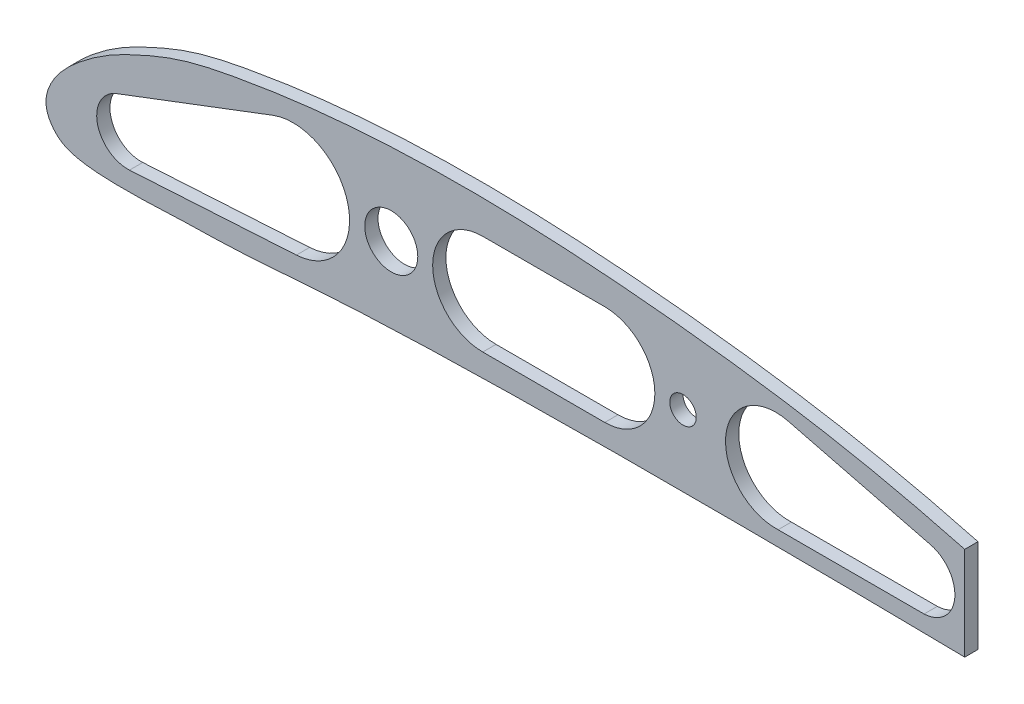
ISO-10303-21;
HEADER;
FILE_DESCRIPTION(('STEP AP214'),'2;1');
FILE_NAME('part.step','',(''),(''),'','','');
FILE_SCHEMA(('AUTOMOTIVE_DESIGN { 1 0 10303 214 1 1 1 1 }'));
ENDSEC;
DATA;
#1=APPLICATION_CONTEXT('core data for automotive mechanical design processes');
#2=APPLICATION_PROTOCOL_DEFINITION('international standard','automotive_design',2000,#1);
#3=PRODUCT_CONTEXT('',#1,'mechanical');
#4=PRODUCT('Part','Part','',(#3));
#5=PRODUCT_RELATED_PRODUCT_CATEGORY('part','',(#4));
#6=PRODUCT_DEFINITION_FORMATION('','',#4);
#7=PRODUCT_DEFINITION_CONTEXT('part definition',#1,'design');
#8=PRODUCT_DEFINITION('design','',#6,#7);
#9=PRODUCT_DEFINITION_SHAPE('','',#8);
#10=(LENGTH_UNIT() NAMED_UNIT(*) SI_UNIT(.MILLI.,.METRE.));
#11=(NAMED_UNIT(*) PLANE_ANGLE_UNIT() SI_UNIT($,.RADIAN.));
#12=(NAMED_UNIT(*) SI_UNIT($,.STERADIAN.) SOLID_ANGLE_UNIT());
#13=UNCERTAINTY_MEASURE_WITH_UNIT(LENGTH_MEASURE(1.E-05),#10,'distance_accuracy_value','');
#14=(GEOMETRIC_REPRESENTATION_CONTEXT(3) GLOBAL_UNCERTAINTY_ASSIGNED_CONTEXT((#13)) GLOBAL_UNIT_ASSIGNED_CONTEXT((#10,
#11,#12)) REPRESENTATION_CONTEXT('',''));
#15=CARTESIAN_POINT('',(0.,0.,0.));
#16=DIRECTION('',(0.,0.,1.));
#17=DIRECTION('',(1.,0.,0.));
#18=AXIS2_PLACEMENT_3D('',#15,#16,#17);
#19=CARTESIAN_POINT('',(59.0328635687362,20.7208074052714,-40.1331610936061));
#20=DIRECTION('',(0.,0.,1.));
#21=DIRECTION('',(1.,0.,0.));
#22=AXIS2_PLACEMENT_3D('',#19,#20,#21);
#23=CYLINDRICAL_SURFACE('',#22,13.5394303652612);
#24=CARTESIAN_POINT('',(59.0328635687362,20.7208074052714,-1.5875));
#25=DIRECTION('',(0.,0.,-1.));
#26=DIRECTION('',(-1.,0.,0.));
#27=AXIS2_PLACEMENT_3D('',#24,#25,#26);
#28=CIRCLE('',#27,13.5394303652612);
#29=CARTESIAN_POINT('',(54.225767065708,33.3781372116063,-1.5875));
#30=VERTEX_POINT('',#29);
#31=CARTESIAN_POINT('',(59.832894926961,7.20503423309904,-1.5875));
#32=VERTEX_POINT('',#31);
#33=EDGE_CURVE('E344',#30,#32,#28,.T.);
#34=ORIENTED_EDGE('',*,*,#33,.T.);
#35=DIRECTION('',(0.,0.,1.));
#36=VECTOR('',#35,1.);
#37=CARTESIAN_POINT('',(59.832894926961,7.20503423309905,-40.1331610936061));
#38=LINE('',#37,#36);
#39=CARTESIAN_POINT('',(59.832894926961,7.20503423309905,1.5875));
#40=VERTEX_POINT('',#39);
#41=EDGE_CURVE('E232',#32,#40,#38,.T.);
#42=ORIENTED_EDGE('',*,*,#41,.T.);
#43=CARTESIAN_POINT('',(59.0328635687362,20.7208074052714,1.5875));
#44=DIRECTION('',(0.,0.,1.));
#45=DIRECTION('',(1.,0.,0.));
#46=AXIS2_PLACEMENT_3D('',#43,#44,#45);
#47=CIRCLE('',#46,13.5394303652612);
#48=CARTESIAN_POINT('',(54.225767065708,33.3781372116063,1.5875));
#49=VERTEX_POINT('',#48);
#50=EDGE_CURVE('E228',#40,#49,#47,.T.);
#51=ORIENTED_EDGE('',*,*,#50,.T.);
#52=DIRECTION('',(0.,0.,1.));
#53=VECTOR('',#52,1.);
#54=CARTESIAN_POINT('',(54.225767065708,33.3781372116063,-40.1331610936061));
#55=LINE('',#54,#53);
#56=EDGE_CURVE('E231',#30,#49,#55,.T.);
#57=ORIENTED_EDGE('',*,*,#56,.F.);
#58=EDGE_LOOP('',(#34,#42,#51,#57));
#59=FACE_BOUND('',#58,.T.);
#60=ADVANCED_FACE('F102',(#59),#23,.F.);
#61=CARTESIAN_POINT('',(16.8041816122865,19.1658842859631,-40.1331610936061));
#62=DIRECTION('',(0.355044220720096,-0.934849507318295,0.));
#63=DIRECTION('',(0.934849507318296,0.355044220720096,0.));
#64=AXIS2_PLACEMENT_3D('',#61,#62,#63);
#65=PLANE('',#64);
#66=ORIENTED_EDGE('',*,*,#56,.T.);
#67=DIRECTION('',(0.934849507318295,0.355044220720096,0.));
#68=VECTOR('',#67,1.);
#69=CARTESIAN_POINT('',(16.8041816122865,19.1658842859631,1.5875));
#70=LINE('',#69,#68);
#71=CARTESIAN_POINT('',(16.8041816122865,19.1658842859631,1.5875));
#72=VERTEX_POINT('',#71);
#73=EDGE_CURVE('E212',#72,#49,#70,.T.);
#74=ORIENTED_EDGE('',*,*,#73,.F.);
#75=DIRECTION('',(0.,0.,1.));
#76=VECTOR('',#75,1.);
#77=CARTESIAN_POINT('',(16.8041816122865,19.1658842859631,-40.1331610936061));
#78=LINE('',#77,#76);
#79=CARTESIAN_POINT('',(16.8041816122865,19.1658842859631,-1.5875));
#80=VERTEX_POINT('',#79);
#81=EDGE_CURVE('E226',#80,#72,#78,.T.);
#82=ORIENTED_EDGE('',*,*,#81,.F.);
#83=DIRECTION('',(-0.934849507318296,-0.355044220720096,0.));
#84=VECTOR('',#83,1.);
#85=CARTESIAN_POINT('',(2.00495325549026,13.5453213418052,-1.5875));
#86=LINE('',#85,#84);
#87=EDGE_CURVE('E241',#30,#80,#86,.T.);
#88=ORIENTED_EDGE('',*,*,#87,.F.);
#89=EDGE_LOOP('',(#66,#74,#82,#88));
#90=FACE_BOUND('',#89,.T.);
#91=ADVANCED_FACE('F267',(#90),#65,.T.);
#92=CARTESIAN_POINT('',(19.4354022409776,12.2377464236183,-40.1331610936061));
#93=DIRECTION('',(0.,0.,1.));
#94=DIRECTION('',(1.,0.,0.));
#95=AXIS2_PLACEMENT_3D('',#92,#93,#94);
#96=CYLINDRICAL_SURFACE('',#95,7.41096594490252);
#97=CARTESIAN_POINT('',(19.4354022409776,12.2377464236183,-1.5875));
#98=DIRECTION('',(0.,0.,-1.));
#99=DIRECTION('',(-1.,0.,0.));
#100=AXIS2_PLACEMENT_3D('',#97,#98,#99);
#101=CIRCLE('',#100,7.41096594490252);
#102=CARTESIAN_POINT('',(19.873308784363,4.83972952070676,-1.5875));
#103=VERTEX_POINT('',#102);
#104=EDGE_CURVE('E339',#103,#80,#101,.T.);
#105=ORIENTED_EDGE('',*,*,#104,.T.);
#106=ORIENTED_EDGE('',*,*,#81,.T.);
#107=CARTESIAN_POINT('',(19.4354022409776,12.2377464236183,1.5875));
#108=DIRECTION('',(0.,0.,1.));
#109=DIRECTION('',(1.,0.,0.));
#110=AXIS2_PLACEMENT_3D('',#107,#108,#109);
#111=CIRCLE('',#110,7.41096594490252);
#112=CARTESIAN_POINT('',(19.873308784363,4.83972952070676,1.5875));
#113=VERTEX_POINT('',#112);
#114=EDGE_CURVE('E238',#72,#113,#111,.T.);
#115=ORIENTED_EDGE('',*,*,#114,.T.);
#116=DIRECTION('',(0.,0.,1.));
#117=VECTOR('',#116,1.);
#118=CARTESIAN_POINT('',(19.873308784363,4.83972952070676,-40.1331610936061));
#119=LINE('',#118,#117);
#120=EDGE_CURVE('E237',#103,#113,#119,.T.);
#121=ORIENTED_EDGE('',*,*,#120,.F.);
#122=EDGE_LOOP('',(#105,#106,#115,#121));
#123=FACE_BOUND('',#122,.T.);
#124=ADVANCED_FACE('F273',(#123),#96,.F.);
#125=CARTESIAN_POINT('',(19.873308784363,4.83972952070676,-40.1331610936061));
#126=DIRECTION('',(0.0590889968515589,-0.998252718729619,0.));
#127=DIRECTION('',(0.998252718729619,0.0590889968515589,0.));
#128=AXIS2_PLACEMENT_3D('',#125,#126,#127);
#129=PLANE('',#128);
#130=DIRECTION('',(-0.998252718729619,-0.0590889968515589,0.));
#131=VECTOR('',#130,1.);
#132=CARTESIAN_POINT('',(2.28735495131891,3.79877430848875,-1.5875));
#133=LINE('',#132,#131);
#134=EDGE_CURVE('E240',#32,#103,#133,.T.);
#135=ORIENTED_EDGE('',*,*,#134,.T.);
#136=ORIENTED_EDGE('',*,*,#120,.T.);
#137=DIRECTION('',(0.998252718729619,0.0590889968515589,0.));
#138=VECTOR('',#137,1.);
#139=CARTESIAN_POINT('',(19.873308784363,4.83972952070676,1.5875));
#140=LINE('',#139,#138);
#141=EDGE_CURVE('E233',#113,#40,#140,.T.);
#142=ORIENTED_EDGE('',*,*,#141,.T.);
#143=ORIENTED_EDGE('',*,*,#41,.F.);
#144=EDGE_LOOP('',(#135,#136,#142,#143));
#145=FACE_BOUND('',#144,.T.);
#146=ADVANCED_FACE('F277',(#145),#129,.F.);
#147=CARTESIAN_POINT('',(133.667500000003,21.4122000122882,-40.1331610936061));
#148=DIRECTION('',(0.,0.,1.));
#149=DIRECTION('',(1.,0.,0.));
#150=AXIS2_PLACEMENT_3D('',#147,#148,#149);
#151=CYLINDRICAL_SURFACE('',#150,11.9939854368826);
#152=CARTESIAN_POINT('',(133.667500000003,21.4122000122882,-1.5875));
#153=DIRECTION('',(0.,0.,-1.));
#154=DIRECTION('',(-1.,0.,0.));
#155=AXIS2_PLACEMENT_3D('',#152,#153,#154);
#156=CIRCLE('',#155,11.9939854368826);
#157=CARTESIAN_POINT('',(133.667500000003,33.4061854491708,-1.5875));
#158=VERTEX_POINT('',#157);
#159=CARTESIAN_POINT('',(133.667500000003,9.41821457540555,-1.5875));
#160=VERTEX_POINT('',#159);
#161=EDGE_CURVE('E236',#158,#160,#156,.T.);
#162=ORIENTED_EDGE('',*,*,#161,.T.);
#163=DIRECTION('',(0.,0.,1.));
#164=VECTOR('',#163,1.);
#165=CARTESIAN_POINT('',(133.667500000003,9.41821457540555,-40.1331610936061));
#166=LINE('',#165,#164);
#167=CARTESIAN_POINT('',(133.667500000003,9.41821457540555,1.5875));
#168=VERTEX_POINT('',#167);
#169=EDGE_CURVE('E356',#160,#168,#166,.T.);
#170=ORIENTED_EDGE('',*,*,#169,.T.);
#171=CARTESIAN_POINT('',(133.667500000003,21.4122000122882,1.5875));
#172=DIRECTION('',(0.,0.,1.));
#173=DIRECTION('',(1.,0.,0.));
#174=AXIS2_PLACEMENT_3D('',#171,#172,#173);
#175=CIRCLE('',#174,11.9939854368826);
#176=CARTESIAN_POINT('',(133.667500000003,33.4061854491708,1.5875));
#177=VERTEX_POINT('',#176);
#178=EDGE_CURVE('E389',#168,#177,#175,.T.);
#179=ORIENTED_EDGE('',*,*,#178,.T.);
#180=DIRECTION('',(0.,0.,1.));
#181=VECTOR('',#180,1.);
#182=CARTESIAN_POINT('',(133.667500000003,33.4061854491708,-40.1331610936061));
#183=LINE('',#182,#181);
#184=EDGE_CURVE('E350',#158,#177,#183,.T.);
#185=ORIENTED_EDGE('',*,*,#184,.F.);
#186=EDGE_LOOP('',(#162,#170,#179,#185));
#187=FACE_BOUND('',#186,.T.);
#188=ADVANCED_FACE('F280',(#187),#151,.F.);
#189=CARTESIAN_POINT('',(104.457500000003,33.4061854491708,-40.1331610936061));
#190=DIRECTION('',(0.,-1.,0.));
#191=DIRECTION('',(1.,0.,0.));
#192=AXIS2_PLACEMENT_3D('',#189,#190,#191);
#193=PLANE('',#192);
#194=ORIENTED_EDGE('',*,*,#184,.T.);
#195=DIRECTION('',(1.,0.,0.));
#196=VECTOR('',#195,1.);
#197=CARTESIAN_POINT('',(104.457500000003,33.4061854491708,1.5875));
#198=LINE('',#197,#196);
#199=CARTESIAN_POINT('',(104.457500000003,33.4061854491708,1.5875));
#200=VERTEX_POINT('',#199);
#201=EDGE_CURVE('E215',#200,#177,#198,.T.);
#202=ORIENTED_EDGE('',*,*,#201,.F.);
#203=DIRECTION('',(0.,0.,1.));
#204=VECTOR('',#203,1.);
#205=CARTESIAN_POINT('',(104.457500000003,33.4061854491708,-40.1331610936061));
#206=LINE('',#205,#204);
#207=CARTESIAN_POINT('',(104.457500000003,33.4061854491708,-1.5875));
#208=VERTEX_POINT('',#207);
#209=EDGE_CURVE('E349',#208,#200,#206,.T.);
#210=ORIENTED_EDGE('',*,*,#209,.F.);
#211=DIRECTION('',(-1.,0.,0.));
#212=VECTOR('',#211,1.);
#213=CARTESIAN_POINT('',(1.65605512116518,33.4061854491707,-1.5875));
#214=LINE('',#213,#212);
#215=EDGE_CURVE('E343',#158,#208,#214,.T.);
#216=ORIENTED_EDGE('',*,*,#215,.F.);
#217=EDGE_LOOP('',(#194,#202,#210,#216));
#218=FACE_BOUND('',#217,.T.);
#219=ADVANCED_FACE('F289',(#218),#193,.T.);
#220=CARTESIAN_POINT('',(104.457500000003,21.4122000122882,-40.1331610936061));
#221=DIRECTION('',(0.,0.,1.));
#222=DIRECTION('',(1.,0.,0.));
#223=AXIS2_PLACEMENT_3D('',#220,#221,#222);
#224=CYLINDRICAL_SURFACE('',#223,11.9939854368826);
#225=CARTESIAN_POINT('',(104.457500000003,21.4122000122882,-1.5875));
#226=DIRECTION('',(0.,0.,-1.));
#227=DIRECTION('',(-1.,0.,0.));
#228=AXIS2_PLACEMENT_3D('',#225,#226,#227);
#229=CIRCLE('',#228,11.9939854368826);
#230=CARTESIAN_POINT('',(104.457500000003,9.41821457540554,-1.5875));
#231=VERTEX_POINT('',#230);
#232=EDGE_CURVE('E347',#231,#208,#229,.T.);
#233=ORIENTED_EDGE('',*,*,#232,.T.);
#234=ORIENTED_EDGE('',*,*,#209,.T.);
#235=CARTESIAN_POINT('',(104.457500000003,21.4122000122882,1.5875));
#236=DIRECTION('',(0.,0.,1.));
#237=DIRECTION('',(1.,0.,0.));
#238=AXIS2_PLACEMENT_3D('',#235,#236,#237);
#239=CIRCLE('',#238,11.9939854368826);
#240=CARTESIAN_POINT('',(104.457500000003,9.41821457540554,1.5875));
#241=VERTEX_POINT('',#240);
#242=EDGE_CURVE('E360',#200,#241,#239,.T.);
#243=ORIENTED_EDGE('',*,*,#242,.T.);
#244=DIRECTION('',(0.,0.,1.));
#245=VECTOR('',#244,1.);
#246=CARTESIAN_POINT('',(104.457500000003,9.41821457540554,-40.1331610936061));
#247=LINE('',#246,#245);
#248=EDGE_CURVE('E359',#231,#241,#247,.T.);
#249=ORIENTED_EDGE('',*,*,#248,.F.);
#250=EDGE_LOOP('',(#233,#234,#243,#249));
#251=FACE_BOUND('',#250,.T.);
#252=ADVANCED_FACE('F285',(#251),#224,.F.);
#253=CARTESIAN_POINT('',(104.457500000003,9.41821457540554,-40.1331610936061));
#254=DIRECTION('',(0.,-1.,0.));
#255=DIRECTION('',(1.,0.,0.));
#256=AXIS2_PLACEMENT_3D('',#253,#254,#255);
#257=PLANE('',#256);
#258=DIRECTION('',(-1.,0.,0.));
#259=VECTOR('',#258,1.);
#260=CARTESIAN_POINT('',(1.65605512116519,9.41821457540552,-1.5875));
#261=LINE('',#260,#259);
#262=EDGE_CURVE('E357',#160,#231,#261,.T.);
#263=ORIENTED_EDGE('',*,*,#262,.T.);
#264=ORIENTED_EDGE('',*,*,#248,.T.);
#265=DIRECTION('',(1.,0.,0.));
#266=VECTOR('',#265,1.);
#267=CARTESIAN_POINT('',(104.457500000003,9.41821457540554,1.5875));
#268=LINE('',#267,#266);
#269=EDGE_CURVE('E373',#241,#168,#268,.T.);
#270=ORIENTED_EDGE('',*,*,#269,.T.);
#271=ORIENTED_EDGE('',*,*,#169,.F.);
#272=EDGE_LOOP('',(#263,#264,#270,#271));
#273=FACE_BOUND('',#272,.T.);
#274=ADVANCED_FACE('F288',(#273),#257,.F.);
#275=CARTESIAN_POINT('',(174.632313846248,19.9630014189328,-40.1331610936061));
#276=DIRECTION('',(0.,0.,1.));
#277=DIRECTION('',(1.,0.,0.));
#278=AXIS2_PLACEMENT_3D('',#275,#276,#277);
#279=CYLINDRICAL_SURFACE('',#278,12.0516750155869);
#280=CARTESIAN_POINT('',(174.632313846248,19.9630014189328,-1.5875));
#281=DIRECTION('',(0.,0.,-1.));
#282=DIRECTION('',(-1.,0.,0.));
#283=AXIS2_PLACEMENT_3D('',#280,#281,#282);
#284=CIRCLE('',#283,12.0516750155869);
#285=CARTESIAN_POINT('',(175.164881598606,7.92309933168679,-1.5875));
#286=VERTEX_POINT('',#285);
#287=CARTESIAN_POINT('',(177.575712719269,31.649714975601,-1.5875));
#288=VERTEX_POINT('',#287);
#289=EDGE_CURVE('E369',#286,#288,#284,.T.);
#290=ORIENTED_EDGE('',*,*,#289,.T.);
#291=DIRECTION('',(0.,0.,1.));
#292=VECTOR('',#291,1.);
#293=CARTESIAN_POINT('',(177.575712719269,31.649714975601,-40.1331610936061));
#294=LINE('',#293,#292);
#295=CARTESIAN_POINT('',(177.575712719269,31.649714975601,1.5875));
#296=VERTEX_POINT('',#295);
#297=EDGE_CURVE('E372',#288,#296,#294,.T.);
#298=ORIENTED_EDGE('',*,*,#297,.T.);
#299=CARTESIAN_POINT('',(174.632313846248,19.9630014189328,1.5875));
#300=DIRECTION('',(0.,0.,1.));
#301=DIRECTION('',(1.,0.,0.));
#302=AXIS2_PLACEMENT_3D('',#299,#300,#301);
#303=CIRCLE('',#302,12.0516750155869);
#304=CARTESIAN_POINT('',(175.164881598606,7.92309933168679,1.5875));
#305=VERTEX_POINT('',#304);
#306=EDGE_CURVE('E368',#296,#305,#303,.T.);
#307=ORIENTED_EDGE('',*,*,#306,.T.);
#308=DIRECTION('',(0.,0.,1.));
#309=VECTOR('',#308,1.);
#310=CARTESIAN_POINT('',(175.164881598606,7.92309933168679,-40.1331610936061));
#311=LINE('',#310,#309);
#312=EDGE_CURVE('E367',#286,#305,#311,.T.);
#313=ORIENTED_EDGE('',*,*,#312,.F.);
#314=EDGE_LOOP('',(#290,#298,#307,#313));
#315=FACE_BOUND('',#314,.T.);
#316=ADVANCED_FACE('F293',(#315),#279,.F.);
#317=CARTESIAN_POINT('',(175.164881598606,7.92309933168644,-40.1331610936061));
#318=DIRECTION('',(0.,-1.,0.));
#319=DIRECTION('',(0.,0.,-1.));
#320=AXIS2_PLACEMENT_3D('',#317,#318,#319);
#321=PLANE('',#320);
#322=DIRECTION('',(-1.,0.,0.));
#323=VECTOR('',#322,1.);
#324=CARTESIAN_POINT('',(1.65605512116519,7.92309933168644,-1.5875));
#325=LINE('',#324,#323);
#326=CARTESIAN_POINT('',(210.117140630324,7.92309933168644,-1.5875));
#327=VERTEX_POINT('',#326);
#328=EDGE_CURVE('E365',#327,#286,#325,.T.);
#329=ORIENTED_EDGE('',*,*,#328,.T.);
#330=ORIENTED_EDGE('',*,*,#312,.T.);
#331=DIRECTION('',(1.,0.,0.));
#332=VECTOR('',#331,1.);
#333=CARTESIAN_POINT('',(175.164881598606,7.92309933168644,1.5875));
#334=LINE('',#333,#332);
#335=CARTESIAN_POINT('',(210.117140630324,7.92309933168644,1.5875));
#336=VERTEX_POINT('',#335);
#337=EDGE_CURVE('E364',#305,#336,#334,.T.);
#338=ORIENTED_EDGE('',*,*,#337,.T.);
#339=DIRECTION('',(0.,0.,1.));
#340=VECTOR('',#339,1.);
#341=CARTESIAN_POINT('',(210.117140630324,7.92309933168644,-40.1331610936061));
#342=LINE('',#341,#340);
#343=EDGE_CURVE('E363',#327,#336,#342,.T.);
#344=ORIENTED_EDGE('',*,*,#343,.F.);
#345=EDGE_LOOP('',(#329,#330,#338,#344));
#346=FACE_BOUND('',#345,.T.);
#347=ADVANCED_FACE('F305',(#346),#321,.F.);
#348=CARTESIAN_POINT('',(209.808003176816,15.6054460212377,-40.1331610936061));
#349=DIRECTION('',(0.,0.,1.));
#350=DIRECTION('',(1.,0.,0.));
#351=AXIS2_PLACEMENT_3D('',#348,#349,#350);
#352=CYLINDRICAL_SURFACE('',#351,7.68856401570672);
#353=CARTESIAN_POINT('',(209.808003176816,15.6054460212377,-1.5875));
#354=DIRECTION('',(0.,0.,-1.));
#355=DIRECTION('',(-1.,0.,0.));
#356=AXIS2_PLACEMENT_3D('',#353,#354,#355);
#357=CIRCLE('',#356,7.68856401570672);
#358=CARTESIAN_POINT('',(211.502653030094,23.1049245696704,-1.5875));
#359=VERTEX_POINT('',#358);
#360=EDGE_CURVE('E361',#359,#327,#357,.T.);
#361=ORIENTED_EDGE('',*,*,#360,.T.);
#362=ORIENTED_EDGE('',*,*,#343,.T.);
#363=CARTESIAN_POINT('',(209.808003176816,15.6054460212377,1.5875));
#364=DIRECTION('',(0.,0.,1.));
#365=DIRECTION('',(1.,0.,0.));
#366=AXIS2_PLACEMENT_3D('',#363,#364,#365);
#367=CIRCLE('',#366,7.68856401570672);
#368=CARTESIAN_POINT('',(211.502653030094,23.1049245696704,1.5875));
#369=VERTEX_POINT('',#368);
#370=EDGE_CURVE('E333',#336,#369,#367,.T.);
#371=ORIENTED_EDGE('',*,*,#370,.T.);
#372=DIRECTION('',(0.,0.,1.));
#373=VECTOR('',#372,1.);
#374=CARTESIAN_POINT('',(211.502653030094,23.1049245696704,-40.1331610936061));
#375=LINE('',#374,#373);
#376=EDGE_CURVE('E328',#359,#369,#375,.T.);
#377=ORIENTED_EDGE('',*,*,#376,.F.);
#378=EDGE_LOOP('',(#361,#362,#371,#377));
#379=FACE_BOUND('',#378,.T.);
#380=ADVANCED_FACE('F301',(#379),#352,.F.);
#381=CARTESIAN_POINT('',(177.575712719269,31.649714975601,-40.1331610936061));
#382=DIRECTION('',(-0.244231517130414,-0.969716951507076,0.));
#383=DIRECTION('',(0.969716951507076,-0.244231517130414,0.));
#384=AXIS2_PLACEMENT_3D('',#381,#382,#383);
#385=PLANE('',#384);
#386=ORIENTED_EDGE('',*,*,#376,.T.);
#387=DIRECTION('',(0.969716951507076,-0.244231517130414,0.));
#388=VECTOR('',#387,1.);
#389=CARTESIAN_POINT('',(177.575712719269,31.649714975601,1.5875));
#390=LINE('',#389,#388);
#391=EDGE_CURVE('E222',#296,#369,#390,.T.);
#392=ORIENTED_EDGE('',*,*,#391,.F.);
#393=ORIENTED_EDGE('',*,*,#297,.F.);
#394=DIRECTION('',(-0.969716951507076,0.244231517130414,0.));
#395=VECTOR('',#394,1.);
#396=CARTESIAN_POINT('',(16.2196820260221,72.2886128654517,-1.5875));
#397=LINE('',#396,#395);
#398=EDGE_CURVE('E353',#359,#288,#397,.T.);
#399=ORIENTED_EDGE('',*,*,#398,.F.);
#400=EDGE_LOOP('',(#386,#392,#393,#399));
#401=FACE_BOUND('',#400,.T.);
#402=ADVANCED_FACE('F304',(#401),#385,.T.);
#403=CARTESIAN_POINT('',(82.5499999999988,21.4122000122836,-1.5875));
#404=DIRECTION('',(0.,0.,1.));
#405=DIRECTION('',(1.,0.,0.));
#406=AXIS2_PLACEMENT_3D('',#403,#404,#405);
#407=CYLINDRICAL_SURFACE('',#406,6.35);
#408=CARTESIAN_POINT('',(82.5499999999988,21.4122000122836,-1.5875));
#409=DIRECTION('',(0.,0.,1.));
#410=DIRECTION('',(1.,0.,0.));
#411=AXIS2_PLACEMENT_3D('',#408,#409,#410);
#412=CIRCLE('',#411,6.35);
#413=CARTESIAN_POINT('',(88.8999999999988,21.4122000122836,-1.5875));
#414=VERTEX_POINT('',#413);
#415=EDGE_CURVE('E322',#414,#414,#412,.T.);
#416=ORIENTED_EDGE('',*,*,#415,.F.);
#417=EDGE_LOOP('',(#416));
#418=FACE_BOUND('',#417,.T.);
#419=CARTESIAN_POINT('',(82.5499999999988,21.4122000122836,1.5875));
#420=DIRECTION('',(0.,0.,1.));
#421=DIRECTION('',(1.,0.,0.));
#422=AXIS2_PLACEMENT_3D('',#419,#420,#421);
#423=CIRCLE('',#422,6.35);
#424=CARTESIAN_POINT('',(88.8999999999988,21.4122000122836,1.5875));
#425=VERTEX_POINT('',#424);
#426=EDGE_CURVE('E325',#425,#425,#423,.T.);
#427=ORIENTED_EDGE('',*,*,#426,.T.);
#428=EDGE_LOOP('',(#427));
#429=FACE_BOUND('',#428,.T.);
#430=ADVANCED_FACE('F261',(#418,#429),#407,.F.);
#431=CARTESIAN_POINT('',(152.4,21.4122000122836,-1.5875));
#432=DIRECTION('',(0.,0.,1.));
#433=DIRECTION('',(1.,0.,0.));
#434=AXIS2_PLACEMENT_3D('',#431,#432,#433);
#435=CYLINDRICAL_SURFACE('',#434,3.175);
#436=CARTESIAN_POINT('',(152.4,21.4122000122836,-1.5875));
#437=DIRECTION('',(0.,0.,1.));
#438=DIRECTION('',(1.,0.,0.));
#439=AXIS2_PLACEMENT_3D('',#436,#437,#438);
#440=CIRCLE('',#439,3.175);
#441=CARTESIAN_POINT('',(155.575,21.4122000122836,-1.5875));
#442=VERTEX_POINT('',#441);
#443=EDGE_CURVE('E336',#442,#442,#440,.T.);
#444=ORIENTED_EDGE('',*,*,#443,.F.);
#445=EDGE_LOOP('',(#444));
#446=FACE_BOUND('',#445,.T.);
#447=CARTESIAN_POINT('',(152.4,21.4122000122836,1.5875));
#448=DIRECTION('',(0.,0.,1.));
#449=DIRECTION('',(1.,0.,0.));
#450=AXIS2_PLACEMENT_3D('',#447,#448,#449);
#451=CIRCLE('',#450,3.175);
#452=CARTESIAN_POINT('',(155.575,21.4122000122836,1.5875));
#453=VERTEX_POINT('',#452);
#454=EDGE_CURVE('E327',#453,#453,#451,.T.);
#455=ORIENTED_EDGE('',*,*,#454,.T.);
#456=EDGE_LOOP('',(#455));
#457=FACE_BOUND('',#456,.T.);
#458=ADVANCED_FACE('F254',(#446,#457),#435,.F.);
#459=CARTESIAN_POINT('',(1.65605512116519,14.4639878907678,-1.5875));
#460=DIRECTION('',(0.,0.,-1.));
#461=DIRECTION('',(-1.,0.,0.));
#462=AXIS2_PLACEMENT_3D('',#459,#460,#461);
#463=PLANE('',#462);
#464=ORIENTED_EDGE('',*,*,#415,.T.);
#465=EDGE_LOOP('',(#464));
#466=FACE_BOUND('',#465,.T.);
#467=ORIENTED_EDGE('',*,*,#443,.T.);
#468=EDGE_LOOP('',(#467));
#469=FACE_BOUND('',#468,.T.);
#470=ORIENTED_EDGE('',*,*,#360,.F.);
#471=ORIENTED_EDGE('',*,*,#398,.T.);
#472=ORIENTED_EDGE('',*,*,#289,.F.);
#473=ORIENTED_EDGE('',*,*,#328,.F.);
#474=EDGE_LOOP('',(#470,#471,#472,#473));
#475=FACE_BOUND('',#474,.T.);
#476=ORIENTED_EDGE('',*,*,#232,.F.);
#477=ORIENTED_EDGE('',*,*,#262,.F.);
#478=ORIENTED_EDGE('',*,*,#161,.F.);
#479=ORIENTED_EDGE('',*,*,#215,.T.);
#480=EDGE_LOOP('',(#476,#477,#478,#479));
#481=FACE_BOUND('',#480,.T.);
#482=ORIENTED_EDGE('',*,*,#104,.F.);
#483=ORIENTED_EDGE('',*,*,#134,.F.);
#484=ORIENTED_EDGE('',*,*,#33,.F.);
#485=ORIENTED_EDGE('',*,*,#87,.T.);
#486=EDGE_LOOP('',(#482,#483,#484,#485));
#487=FACE_BOUND('',#486,.T.);
#488=CARTESIAN_POINT('',(304.8,0.,-1.5875));
#489=CARTESIAN_POINT('',(305.077640244681,0.670235949008001,-1.5875));
#490=CARTESIAN_POINT('',(287.206651557549,5.72014346783749,-1.5875));
#491=CARTESIAN_POINT('',(270.662795429074,11.3970544887587,-1.5875));
#492=CARTESIAN_POINT('',(243.463273841648,19.4859206004711,-1.5875));
#493=CARTESIAN_POINT('',(213.747912644984,28.2099572247865,-1.5875));
#494=CARTESIAN_POINT('',(183.040246215652,34.6765948811052,-1.5875));
#495=CARTESIAN_POINT('',(152.4919465254,38.6289899500206,-1.5875));
#496=CARTESIAN_POINT('',(121.966980876844,41.172895409398,-1.5875));
#497=CARTESIAN_POINT('',(91.4149280659883,41.7230127486465,-1.5875));
#498=CARTESIAN_POINT('',(65.9274954962046,40.0620135064187,-1.5875));
#499=CARTESIAN_POINT('',(45.6250038216973,37.0045999100277,-1.5875));
#500=CARTESIAN_POINT('',(32.7277103548807,34.3521427962271,-1.5875));
#501=CARTESIAN_POINT('',(22.7317956157464,30.1965290437229,-1.5875));
#502=CARTESIAN_POINT('',(14.9072257071245,26.4612505881115,-1.5875));
#503=CARTESIAN_POINT('',(8.51628352714233,21.9644178457254,-1.5875));
#504=CARTESIAN_POINT('',(2.53745558093638,16.4884644553953,-1.5875));
#505=CARTESIAN_POINT('',(-1.96447989389202,8.89390689304449,-1.5875));
#506=CARTESIAN_POINT('',(2.84193009807859,2.33492302764709,-1.5875));
#507=CARTESIAN_POINT('',(8.77882949074113,0.629027732179887,-1.5875));
#508=CARTESIAN_POINT('',(15.2287936628024,0.221834685012508,-1.5875));
#509=CARTESIAN_POINT('',(22.8635764639965,0.239109805904665,-1.5875));
#510=CARTESIAN_POINT('',(33.0156316728747,0.788100741553244,-1.5875));
#511=CARTESIAN_POINT('',(45.7404190780474,0.855312608130182,-1.5875));
#512=CARTESIAN_POINT('',(66.0183969786535,2.65839434977953,-1.5875));
#513=CARTESIAN_POINT('',(91.4265780864865,3.79492631367271,-1.5875));
#514=CARTESIAN_POINT('',(121.915270130211,4.33221739110161,-1.5875));
#515=CARTESIAN_POINT('',(152.408348669622,4.47906680792443,-1.5875));
#516=CARTESIAN_POINT('',(182.849810214161,4.26910364888094,-1.5875));
#517=CARTESIAN_POINT('',(213.479164171133,4.04767027141658,-1.5875));
#518=CARTESIAN_POINT('',(243.430144591887,3.31397178943146,-1.5875));
#519=CARTESIAN_POINT('',(270.486497521151,1.37051361290602,-1.5875));
#520=CARTESIAN_POINT('',(287.394329758651,1.44240402655394,-1.5875));
#521=CARTESIAN_POINT('',(304.536665056553,-0.635702313008765,-1.5875));
#522=CARTESIAN_POINT('',(304.8,0.,-1.5875));
#523=B_SPLINE_CURVE_WITH_KNOTS('',3,(#488,#489,#490,#491,#492,#493,#494,#495,#496,#497,#498,
#499,#500,#501,#502,#503,#504,#505,#506,#507,#508,#509,#510,#511,#512,#513,#514,#515,#516,#517,
#518,#519,#520,#521,#522),.UNSPECIFIED.,.T.,.F.,(4,1,1,1,1,1,1,1,1,1,1,1,1,1,1,1,1,1,1,1,1,1,1,
1,1,1,1,1,1,1,1,1,4),(0.,0.0255560444991772,0.050960447010779,0.101552747326171,
0.151805437773323,0.201252492284918,0.250083001864764,0.298629140589189,0.347026117124877,
0.395536064294317,0.420002518911991,0.444885367904301,0.457915186872697,0.47144103148067,
0.486208379890319,0.494593530866719,0.510948222410887,0.521394630718682,0.527823605666163,
0.539981827808652,0.552079711007262,0.564187268644203,0.588393920687583,0.612648894272303,
0.661100878724036,0.709502088857399,0.75789422654222,0.80628636422704,0.854680316537635,
0.903093620624395,0.951545605076128,0.975760720350009,1.),.UNSPECIFIED.);
#524=CARTESIAN_POINT('',(219.855455248947,26.2054644145785,-1.5875));
#525=VERTEX_POINT('',#524);
#526=CARTESIAN_POINT('',(219.855455248942,3.84624000554485,-1.5875));
#527=VERTEX_POINT('',#526);
#528=EDGE_CURVE('E206',#525,#527,#523,.T.);
#529=ORIENTED_EDGE('',*,*,#528,.F.);
#530=DIRECTION('',(-2.38338791217091E-13,-1.,0.));
#531=VECTOR('',#530,1.);
#532=CARTESIAN_POINT('',(219.855455248945,14.4639878907158,-1.5875));
#533=LINE('',#532,#531);
#534=EDGE_CURVE('E122',#525,#527,#533,.T.);
#535=ORIENTED_EDGE('',*,*,#534,.T.);
#536=EDGE_LOOP('',(#529,#535));
#537=FACE_BOUND('',#536,.T.);
#538=ADVANCED_FACE('F252',(#466,#469,#475,#481,#487,#537),#463,.T.);
#539=CARTESIAN_POINT('',(1.65605512116519,14.4639878907678,1.5875));
#540=DIRECTION('',(0.,0.,-1.));
#541=DIRECTION('',(-1.,0.,0.));
#542=AXIS2_PLACEMENT_3D('',#539,#540,#541);
#543=PLANE('',#542);
#544=ORIENTED_EDGE('',*,*,#454,.F.);
#545=EDGE_LOOP('',(#544));
#546=FACE_BOUND('',#545,.T.);
#547=ORIENTED_EDGE('',*,*,#426,.F.);
#548=EDGE_LOOP('',(#547));
#549=FACE_BOUND('',#548,.T.);
#550=ORIENTED_EDGE('',*,*,#391,.T.);
#551=ORIENTED_EDGE('',*,*,#370,.F.);
#552=ORIENTED_EDGE('',*,*,#337,.F.);
#553=ORIENTED_EDGE('',*,*,#306,.F.);
#554=EDGE_LOOP('',(#550,#551,#552,#553));
#555=FACE_BOUND('',#554,.T.);
#556=ORIENTED_EDGE('',*,*,#269,.F.);
#557=ORIENTED_EDGE('',*,*,#242,.F.);
#558=ORIENTED_EDGE('',*,*,#201,.T.);
#559=ORIENTED_EDGE('',*,*,#178,.F.);
#560=EDGE_LOOP('',(#556,#557,#558,#559));
#561=FACE_BOUND('',#560,.T.);
#562=ORIENTED_EDGE('',*,*,#141,.F.);
#563=ORIENTED_EDGE('',*,*,#114,.F.);
#564=ORIENTED_EDGE('',*,*,#73,.T.);
#565=ORIENTED_EDGE('',*,*,#50,.F.);
#566=EDGE_LOOP('',(#562,#563,#564,#565));
#567=FACE_BOUND('',#566,.T.);
#568=DIRECTION('',(-2.38338791217091E-13,-1.,0.));
#569=VECTOR('',#568,1.);
#570=CARTESIAN_POINT('',(219.855455248945,14.4639878907158,1.5875));
#571=LINE('',#570,#569);
#572=CARTESIAN_POINT('',(219.855455232331,26.2054644190162,1.5875));
#573=VERTEX_POINT('',#572);
#574=CARTESIAN_POINT('',(219.855455248942,3.84624000554485,1.5875));
#575=VERTEX_POINT('',#574);
#576=EDGE_CURVE('E114',#573,#575,#571,.T.);
#577=ORIENTED_EDGE('',*,*,#576,.F.);
#578=CARTESIAN_POINT('',(304.8,0.,1.5875));
#579=CARTESIAN_POINT('',(305.077640244681,0.670235949008001,1.5875));
#580=CARTESIAN_POINT('',(287.206651557549,5.72014346783749,1.5875));
#581=CARTESIAN_POINT('',(270.662795429074,11.3970544887587,1.5875));
#582=CARTESIAN_POINT('',(243.463273841648,19.4859206004711,1.5875));
#583=CARTESIAN_POINT('',(213.747912644984,28.2099572247865,1.5875));
#584=CARTESIAN_POINT('',(183.040246215652,34.6765948811052,1.5875));
#585=CARTESIAN_POINT('',(152.4919465254,38.6289899500206,1.5875));
#586=CARTESIAN_POINT('',(121.966980876844,41.172895409398,1.5875));
#587=CARTESIAN_POINT('',(91.4149280659883,41.7230127486465,1.5875));
#588=CARTESIAN_POINT('',(65.9274954962046,40.0620135064187,1.5875));
#589=CARTESIAN_POINT('',(45.6250038216973,37.0045999100277,1.5875));
#590=CARTESIAN_POINT('',(32.7277103548807,34.3521427962271,1.5875));
#591=CARTESIAN_POINT('',(22.7317956157464,30.1965290437229,1.5875));
#592=CARTESIAN_POINT('',(14.9072257071245,26.4612505881115,1.5875));
#593=CARTESIAN_POINT('',(8.51628352714233,21.9644178457254,1.5875));
#594=CARTESIAN_POINT('',(2.53745558093638,16.4884644553953,1.5875));
#595=CARTESIAN_POINT('',(-1.96447989389202,8.89390689304449,1.5875));
#596=CARTESIAN_POINT('',(2.84193009807859,2.33492302764709,1.5875));
#597=CARTESIAN_POINT('',(8.77882949074113,0.629027732179887,1.5875));
#598=CARTESIAN_POINT('',(15.2287936628024,0.221834685012508,1.5875));
#599=CARTESIAN_POINT('',(22.8635764639965,0.239109805904665,1.5875));
#600=CARTESIAN_POINT('',(33.0156316728747,0.788100741553244,1.5875));
#601=CARTESIAN_POINT('',(45.7404190780474,0.855312608130182,1.5875));
#602=CARTESIAN_POINT('',(66.0183969786535,2.65839434977953,1.5875));
#603=CARTESIAN_POINT('',(91.4265780864865,3.79492631367271,1.5875));
#604=CARTESIAN_POINT('',(121.915270130211,4.33221739110161,1.5875));
#605=CARTESIAN_POINT('',(152.408348669622,4.47906680792443,1.5875));
#606=CARTESIAN_POINT('',(182.849810214161,4.26910364888094,1.5875));
#607=CARTESIAN_POINT('',(213.479164171133,4.04767027141658,1.5875));
#608=CARTESIAN_POINT('',(243.430144591887,3.31397178943146,1.5875));
#609=CARTESIAN_POINT('',(270.486497521151,1.37051361290602,1.5875));
#610=CARTESIAN_POINT('',(287.394329758651,1.44240402655394,1.5875));
#611=CARTESIAN_POINT('',(304.536665056553,-0.635702313008765,1.5875));
#612=CARTESIAN_POINT('',(304.8,0.,1.5875));
#613=B_SPLINE_CURVE_WITH_KNOTS('',3,(#578,#579,#580,#581,#582,#583,#584,#585,#586,#587,#588,
#589,#590,#591,#592,#593,#594,#595,#596,#597,#598,#599,#600,#601,#602,#603,#604,#605,#606,#607,
#608,#609,#610,#611,#612),.UNSPECIFIED.,.T.,.F.,(4,1,1,1,1,1,1,1,1,1,1,1,1,1,1,1,1,1,1,1,1,1,1,
1,1,1,1,1,1,1,1,1,4),(0.,0.0255560444991772,0.050960447010779,0.101552747326171,
0.151805437773323,0.201252492284918,0.250083001864764,0.298629140589189,0.347026117124877,
0.395536064294317,0.420002518911991,0.444885367904301,0.457915186872697,0.47144103148067,
0.486208379890319,0.494593530866719,0.510948222410887,0.521394630718682,0.527823605666163,
0.539981827808652,0.552079711007262,0.564187268644203,0.588393920687583,0.612648894272303,
0.661100878724036,0.709502088857399,0.75789422654222,0.80628636422704,0.854680316537635,
0.903093620624395,0.951545605076128,0.975760720350009,1.),.UNSPECIFIED.);
#614=EDGE_CURVE('E106',#573,#575,#613,.T.);
#615=ORIENTED_EDGE('',*,*,#614,.T.);
#616=EDGE_LOOP('',(#577,#615));
#617=FACE_BOUND('',#616,.T.);
#618=ADVANCED_FACE('F104',(#546,#549,#555,#561,#567,#617),#543,.F.);
#619=DIRECTION('',(0.,0.,1.));
#620=VECTOR('',#619,1.);
#621=SURFACE_OF_LINEAR_EXTRUSION('',#523,#620);
#622=ORIENTED_EDGE('',*,*,#614,.F.);
#623=DIRECTION('',(0.,0.,1.));
#624=VECTOR('',#623,1.);
#625=CARTESIAN_POINT('',(219.855455248947,26.2054644145785,-1.5875));
#626=LINE('',#625,#624);
#627=EDGE_CURVE('E199',#573,#525,#626,.F.);
#628=ORIENTED_EDGE('',*,*,#627,.T.);
#629=ORIENTED_EDGE('',*,*,#528,.T.);
#630=DIRECTION('',(0.,0.,-1.));
#631=VECTOR('',#630,1.);
#632=CARTESIAN_POINT('',(219.855455248942,3.84624000554485,5.08));
#633=LINE('',#632,#631);
#634=EDGE_CURVE('E12',#575,#527,#633,.T.);
#635=ORIENTED_EDGE('',*,*,#634,.F.);
#636=EDGE_LOOP('',(#622,#628,#629,#635));
#637=FACE_BOUND('',#636,.T.);
#638=ADVANCED_FACE('F210',(#637),#621,.T.);
#639=CARTESIAN_POINT('',(219.855455248947,26.2054644145785,5.08));
#640=DIRECTION('',(1.,-2.38338791217091E-13,0.));
#641=DIRECTION('',(2.38338791217091E-13,1.,0.));
#642=AXIS2_PLACEMENT_3D('',#639,#640,#641);
#643=PLANE('',#642);
#644=ORIENTED_EDGE('',*,*,#627,.F.);
#645=ORIENTED_EDGE('',*,*,#576,.T.);
#646=ORIENTED_EDGE('',*,*,#634,.T.);
#647=ORIENTED_EDGE('',*,*,#534,.F.);
#648=EDGE_LOOP('',(#644,#645,#646,#647));
#649=FACE_BOUND('',#648,.T.);
#650=ADVANCED_FACE('F203',(#649),#643,.T.);
#651=CLOSED_SHELL('',(#60,#91,#124,#146,#188,#219,#252,#274,#316,#347,#380,#402,#430,#458,#538,
#618,#638,#650));
#652=MANIFOLD_SOLID_BREP('B2',#651);
#653=ADVANCED_BREP_SHAPE_REPRESENTATION('',(#18,#652),#14);
#654=SHAPE_DEFINITION_REPRESENTATION(#9,#653);
ENDSEC;
END-ISO-10303-21;
